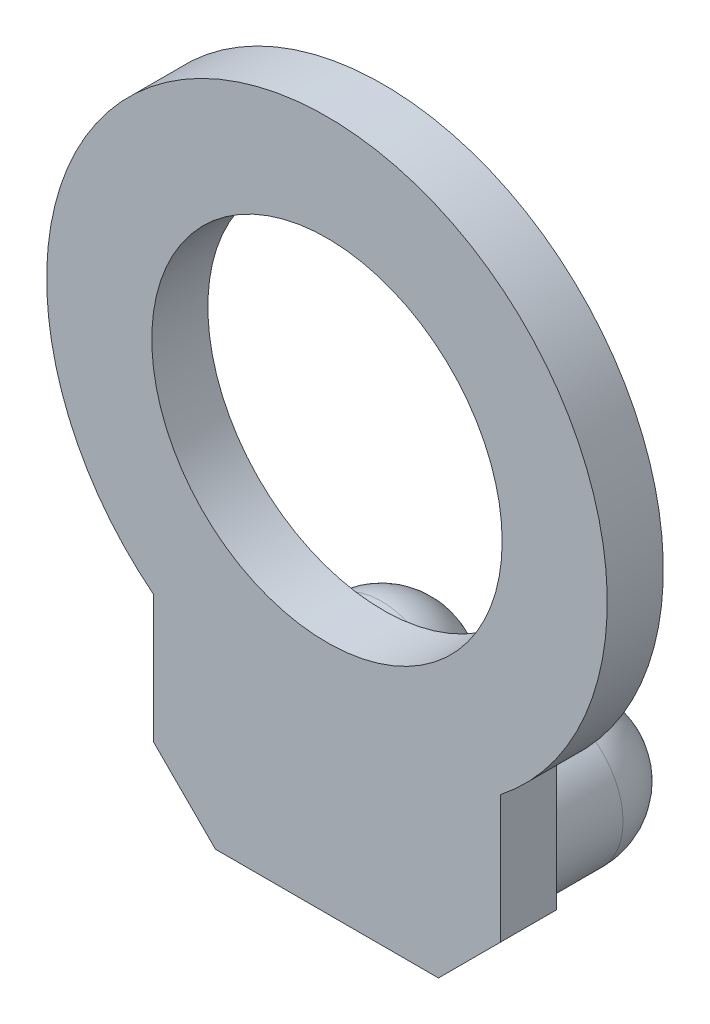
ISO-10303-21;
HEADER;
FILE_DESCRIPTION(('STEP AP214'),'2;1');
FILE_NAME('part.step','',(''),(''),'','','');
FILE_SCHEMA(('AUTOMOTIVE_DESIGN { 1 0 10303 214 1 1 1 1 }'));
ENDSEC;
DATA;
#1=APPLICATION_CONTEXT('core data for automotive mechanical design processes');
#2=APPLICATION_PROTOCOL_DEFINITION('international standard','automotive_design',2000,#1);
#3=PRODUCT_CONTEXT('',#1,'mechanical');
#4=PRODUCT('Part','Part','',(#3));
#5=PRODUCT_RELATED_PRODUCT_CATEGORY('part','',(#4));
#6=PRODUCT_DEFINITION_FORMATION('','',#4);
#7=PRODUCT_DEFINITION_CONTEXT('part definition',#1,'design');
#8=PRODUCT_DEFINITION('design','',#6,#7);
#9=PRODUCT_DEFINITION_SHAPE('','',#8);
#10=(LENGTH_UNIT() NAMED_UNIT(*) SI_UNIT(.MILLI.,.METRE.));
#11=(NAMED_UNIT(*) PLANE_ANGLE_UNIT() SI_UNIT($,.RADIAN.));
#12=(NAMED_UNIT(*) SI_UNIT($,.STERADIAN.) SOLID_ANGLE_UNIT());
#13=UNCERTAINTY_MEASURE_WITH_UNIT(LENGTH_MEASURE(1.E-05),#10,'distance_accuracy_value','');
#14=(GEOMETRIC_REPRESENTATION_CONTEXT(3) GLOBAL_UNCERTAINTY_ASSIGNED_CONTEXT((#13)) GLOBAL_UNIT_ASSIGNED_CONTEXT((#10,
#11,#12)) REPRESENTATION_CONTEXT('',''));
#15=CARTESIAN_POINT('',(0.,0.,0.));
#16=DIRECTION('',(0.,0.,1.));
#17=DIRECTION('',(1.,0.,0.));
#18=AXIS2_PLACEMENT_3D('',#15,#16,#17);
#19=CARTESIAN_POINT('',(4.95000000000013,0.,1.6));
#20=DIRECTION('',(-1.,0.,0.));
#21=DIRECTION('',(0.,-1.,0.));
#22=AXIS2_PLACEMENT_3D('',#19,#20,#21);
#23=PLANE('',#22);
#24=DIRECTION('',(0.,1.,0.));
#25=VECTOR('',#24,1.);
#26=CARTESIAN_POINT('',(4.95000000000013,0.,0.));
#27=LINE('',#26,#25);
#28=CARTESIAN_POINT('',(4.95000000000011,-9.93223304703357,0.));
#29=VERTEX_POINT('',#28);
#30=CARTESIAN_POINT('',(4.95000000000011,-6.28470365252005,0.));
#31=VERTEX_POINT('',#30);
#32=EDGE_CURVE('E132',#29,#31,#27,.T.);
#33=ORIENTED_EDGE('',*,*,#32,.T.);
#34=DIRECTION('',(0.,0.,-1.));
#35=VECTOR('',#34,1.);
#36=CARTESIAN_POINT('',(4.95000000000011,-6.28470365252005,1.6));
#37=LINE('',#36,#35);
#38=CARTESIAN_POINT('',(4.95000000000011,-6.28470365252005,1.6));
#39=VERTEX_POINT('',#38);
#40=EDGE_CURVE('E152',#39,#31,#37,.T.);
#41=ORIENTED_EDGE('',*,*,#40,.F.);
#42=DIRECTION('',(0.,1.,0.));
#43=VECTOR('',#42,1.);
#44=CARTESIAN_POINT('',(4.95000000000013,0.,1.6));
#45=LINE('',#44,#43);
#46=CARTESIAN_POINT('',(4.95000000000011,-9.93223304703357,1.6));
#47=VERTEX_POINT('',#46);
#48=EDGE_CURVE('E207',#47,#39,#45,.T.);
#49=ORIENTED_EDGE('',*,*,#48,.F.);
#50=DIRECTION('',(0.,0.,-1.));
#51=VECTOR('',#50,1.);
#52=CARTESIAN_POINT('',(4.95000000000011,-9.93223304703357,1.6));
#53=LINE('',#52,#51);
#54=EDGE_CURVE('E59',#47,#29,#53,.T.);
#55=ORIENTED_EDGE('',*,*,#54,.T.);
#56=EDGE_LOOP('',(#33,#41,#49,#55));
#57=FACE_BOUND('',#56,.T.);
#58=ADVANCED_FACE('F42',(#57),#23,.F.);
#59=CARTESIAN_POINT('',(1.2490009027033E-13,0.,1.6));
#60=DIRECTION('',(0.,0.,-1.));
#61=DIRECTION('',(-1.,0.,0.));
#62=AXIS2_PLACEMENT_3D('',#59,#60,#61);
#63=CYLINDRICAL_SURFACE('',#62,8.);
#64=CARTESIAN_POINT('',(1.2490009027033E-13,0.,0.));
#65=DIRECTION('',(0.,0.,1.));
#66=DIRECTION('',(1.,0.,0.));
#67=AXIS2_PLACEMENT_3D('',#64,#65,#66);
#68=CIRCLE('',#67,8.);
#69=CARTESIAN_POINT('',(-4.94999999999989,-6.28470365252004,0.));
#70=VERTEX_POINT('',#69);
#71=EDGE_CURVE('E135',#31,#70,#68,.T.);
#72=ORIENTED_EDGE('',*,*,#71,.T.);
#73=DIRECTION('',(0.,0.,-1.));
#74=VECTOR('',#73,1.);
#75=CARTESIAN_POINT('',(-4.94999999999989,-6.28470365252004,1.6));
#76=LINE('',#75,#74);
#77=CARTESIAN_POINT('',(-4.94999999999989,-6.28470365252004,1.6));
#78=VERTEX_POINT('',#77);
#79=EDGE_CURVE('E149',#78,#70,#76,.T.);
#80=ORIENTED_EDGE('',*,*,#79,.F.);
#81=CARTESIAN_POINT('',(1.2490009027033E-13,0.,1.6));
#82=DIRECTION('',(0.,0.,1.));
#83=DIRECTION('',(1.,0.,0.));
#84=AXIS2_PLACEMENT_3D('',#81,#82,#83);
#85=CIRCLE('',#84,8.);
#86=EDGE_CURVE('E93',#39,#78,#85,.T.);
#87=ORIENTED_EDGE('',*,*,#86,.F.);
#88=ORIENTED_EDGE('',*,*,#40,.T.);
#89=EDGE_LOOP('',(#72,#80,#87,#88));
#90=FACE_BOUND('',#89,.T.);
#91=ADVANCED_FACE('F171',(#90),#63,.T.);
#92=CARTESIAN_POINT('',(-4.94999999999988,0.,1.6));
#93=DIRECTION('',(1.,0.,0.));
#94=DIRECTION('',(0.,1.,0.));
#95=AXIS2_PLACEMENT_3D('',#92,#93,#94);
#96=PLANE('',#95);
#97=DIRECTION('',(0.,-1.,0.));
#98=VECTOR('',#97,1.);
#99=CARTESIAN_POINT('',(-4.94999999999988,0.,0.));
#100=LINE('',#99,#98);
#101=CARTESIAN_POINT('',(-4.94999999999989,-9.9322330470335,0.));
#102=VERTEX_POINT('',#101);
#103=EDGE_CURVE('E137',#70,#102,#100,.T.);
#104=ORIENTED_EDGE('',*,*,#103,.T.);
#105=DIRECTION('',(0.,0.,-1.));
#106=VECTOR('',#105,1.);
#107=CARTESIAN_POINT('',(-4.94999999999989,-9.9322330470335,1.6));
#108=LINE('',#107,#106);
#109=CARTESIAN_POINT('',(-4.94999999999989,-9.9322330470335,1.6));
#110=VERTEX_POINT('',#109);
#111=EDGE_CURVE('E121',#110,#102,#108,.T.);
#112=ORIENTED_EDGE('',*,*,#111,.F.);
#113=DIRECTION('',(0.,-1.,0.));
#114=VECTOR('',#113,1.);
#115=CARTESIAN_POINT('',(-4.94999999999988,0.,1.6));
#116=LINE('',#115,#114);
#117=EDGE_CURVE('E109',#78,#110,#116,.T.);
#118=ORIENTED_EDGE('',*,*,#117,.F.);
#119=ORIENTED_EDGE('',*,*,#79,.T.);
#120=EDGE_LOOP('',(#104,#112,#118,#119));
#121=FACE_BOUND('',#120,.T.);
#122=ADVANCED_FACE('F176',(#121),#96,.F.);
#123=CARTESIAN_POINT('',(-7.44111652351668,-7.44111652351672,1.6));
#124=DIRECTION('',(0.707106781186546,0.707106781186549,0.));
#125=DIRECTION('',(-0.707106781186549,0.707106781186546,0.));
#126=AXIS2_PLACEMENT_3D('',#123,#124,#125);
#127=PLANE('',#126);
#128=DIRECTION('',(0.707106781186549,-0.707106781186546,0.));
#129=VECTOR('',#128,1.);
#130=CARTESIAN_POINT('',(-7.44111652351668,-7.44111652351672,0.));
#131=LINE('',#130,#129);
#132=CARTESIAN_POINT('',(-3.18223304703352,-11.6999999999999,0.));
#133=VERTEX_POINT('',#132);
#134=EDGE_CURVE('E118',#102,#133,#131,.T.);
#135=ORIENTED_EDGE('',*,*,#134,.T.);
#136=DIRECTION('',(0.,0.,-1.));
#137=VECTOR('',#136,1.);
#138=CARTESIAN_POINT('',(-3.18223304703352,-11.6999999999999,1.6));
#139=LINE('',#138,#137);
#140=CARTESIAN_POINT('',(-3.18223304703352,-11.6999999999999,1.6));
#141=VERTEX_POINT('',#140);
#142=EDGE_CURVE('E115',#141,#133,#139,.T.);
#143=ORIENTED_EDGE('',*,*,#142,.F.);
#144=DIRECTION('',(0.707106781186549,-0.707106781186546,0.));
#145=VECTOR('',#144,1.);
#146=CARTESIAN_POINT('',(-7.44111652351668,-7.44111652351672,1.6));
#147=LINE('',#146,#145);
#148=EDGE_CURVE('E102',#110,#141,#147,.T.);
#149=ORIENTED_EDGE('',*,*,#148,.F.);
#150=ORIENTED_EDGE('',*,*,#111,.T.);
#151=EDGE_LOOP('',(#135,#143,#149,#150));
#152=FACE_BOUND('',#151,.T.);
#153=ADVANCED_FACE('F116',(#152),#127,.F.);
#154=CARTESIAN_POINT('',(-1.56260863688872E-13,-11.6999999999999,1.6));
#155=DIRECTION('',(0.,1.,0.));
#156=DIRECTION('',(-1.,0.,0.));
#157=AXIS2_PLACEMENT_3D('',#154,#155,#156);
#158=PLANE('',#157);
#159=DIRECTION('',(1.,0.,0.));
#160=VECTOR('',#159,1.);
#161=CARTESIAN_POINT('',(-1.56260863688872E-13,-11.6999999999999,0.));
#162=LINE('',#161,#160);
#163=CARTESIAN_POINT('',(3.18223304703374,-11.6999999999999,0.));
#164=VERTEX_POINT('',#163);
#165=EDGE_CURVE('E140',#133,#164,#162,.T.);
#166=ORIENTED_EDGE('',*,*,#165,.T.);
#167=DIRECTION('',(0.,0.,-1.));
#168=VECTOR('',#167,1.);
#169=CARTESIAN_POINT('',(3.18223304703374,-11.6999999999999,1.6));
#170=LINE('',#169,#168);
#171=CARTESIAN_POINT('',(3.18223304703374,-11.6999999999999,1.6));
#172=VERTEX_POINT('',#171);
#173=EDGE_CURVE('E80',#172,#164,#170,.T.);
#174=ORIENTED_EDGE('',*,*,#173,.F.);
#175=DIRECTION('',(1.,0.,0.));
#176=VECTOR('',#175,1.);
#177=CARTESIAN_POINT('',(-1.56260863688872E-13,-11.6999999999999,1.6));
#178=LINE('',#177,#176);
#179=EDGE_CURVE('E107',#141,#172,#178,.T.);
#180=ORIENTED_EDGE('',*,*,#179,.F.);
#181=ORIENTED_EDGE('',*,*,#142,.T.);
#182=EDGE_LOOP('',(#166,#174,#180,#181));
#183=FACE_BOUND('',#182,.T.);
#184=ADVANCED_FACE('F123',(#183),#158,.F.);
#185=CARTESIAN_POINT('',(1.2490009027033E-13,0.,1.6));
#186=DIRECTION('',(0.,0.,-1.));
#187=DIRECTION('',(-1.,0.,0.));
#188=AXIS2_PLACEMENT_3D('',#185,#186,#187);
#189=CYLINDRICAL_SURFACE('',#188,4.99999999999985);
#190=CARTESIAN_POINT('',(1.2490009027033E-13,0.,1.6));
#191=DIRECTION('',(0.,0.,1.));
#192=DIRECTION('',(1.,0.,0.));
#193=AXIS2_PLACEMENT_3D('',#190,#191,#192);
#194=CIRCLE('',#193,4.99999999999985);
#195=CARTESIAN_POINT('',(4.99999999999998,0.,1.6));
#196=VERTEX_POINT('',#195);
#197=EDGE_CURVE('E145',#196,#196,#194,.T.);
#198=ORIENTED_EDGE('',*,*,#197,.T.);
#199=EDGE_LOOP('',(#198));
#200=FACE_BOUND('',#199,.T.);
#201=CARTESIAN_POINT('',(1.2490009027033E-13,0.,0.));
#202=DIRECTION('',(0.,0.,1.));
#203=DIRECTION('',(1.,0.,0.));
#204=AXIS2_PLACEMENT_3D('',#201,#202,#203);
#205=CIRCLE('',#204,4.99999999999985);
#206=CARTESIAN_POINT('',(4.99999999999998,0.,0.));
#207=VERTEX_POINT('',#206);
#208=EDGE_CURVE('E129',#207,#207,#205,.T.);
#209=ORIENTED_EDGE('',*,*,#208,.F.);
#210=EDGE_LOOP('',(#209));
#211=FACE_BOUND('',#210,.T.);
#212=ADVANCED_FACE('F179',(#200,#211),#189,.F.);
#213=CARTESIAN_POINT('',(7.44111652351685,-7.44111652351681,1.6));
#214=DIRECTION('',(0.70710678118655,-0.707106781186545,0.));
#215=DIRECTION('',(0.707106781186545,0.70710678118655,0.));
#216=AXIS2_PLACEMENT_3D('',#213,#214,#215);
#217=PLANE('',#216);
#218=DIRECTION('',(-0.707106781186545,-0.70710678118655,0.));
#219=VECTOR('',#218,1.);
#220=CARTESIAN_POINT('',(7.44111652351685,-7.44111652351681,0.));
#221=LINE('',#220,#219);
#222=EDGE_CURVE('E142',#29,#164,#221,.T.);
#223=ORIENTED_EDGE('',*,*,#222,.F.);
#224=ORIENTED_EDGE('',*,*,#54,.F.);
#225=DIRECTION('',(-0.707106781186545,-0.70710678118655,0.));
#226=VECTOR('',#225,1.);
#227=CARTESIAN_POINT('',(7.44111652351685,-7.44111652351681,1.6));
#228=LINE('',#227,#226);
#229=EDGE_CURVE('E124',#47,#172,#228,.T.);
#230=ORIENTED_EDGE('',*,*,#229,.T.);
#231=ORIENTED_EDGE('',*,*,#173,.T.);
#232=EDGE_LOOP('',(#223,#224,#230,#231));
#233=FACE_BOUND('',#232,.T.);
#234=ADVANCED_FACE('F181',(#233),#217,.T.);
#235=CARTESIAN_POINT('',(0.,0.,1.6));
#236=DIRECTION('',(0.,0.,1.));
#237=DIRECTION('',(1.,0.,0.));
#238=AXIS2_PLACEMENT_3D('',#235,#236,#237);
#239=PLANE('',#238);
#240=ORIENTED_EDGE('',*,*,#197,.F.);
#241=EDGE_LOOP('',(#240));
#242=FACE_BOUND('',#241,.T.);
#243=ORIENTED_EDGE('',*,*,#48,.T.);
#244=ORIENTED_EDGE('',*,*,#86,.T.);
#245=ORIENTED_EDGE('',*,*,#117,.T.);
#246=ORIENTED_EDGE('',*,*,#148,.T.);
#247=ORIENTED_EDGE('',*,*,#179,.T.);
#248=ORIENTED_EDGE('',*,*,#229,.F.);
#249=EDGE_LOOP('',(#243,#244,#245,#246,#247,#248));
#250=FACE_BOUND('',#249,.T.);
#251=ADVANCED_FACE('F104',(#242,#250),#239,.T.);
#252=CARTESIAN_POINT('',(0.,0.,0.));
#253=DIRECTION('',(0.,0.,1.));
#254=DIRECTION('',(1.,0.,0.));
#255=AXIS2_PLACEMENT_3D('',#252,#253,#254);
#256=PLANE('',#255);
#257=ORIENTED_EDGE('',*,*,#208,.T.);
#258=EDGE_LOOP('',(#257));
#259=FACE_BOUND('',#258,.T.);
#260=CARTESIAN_POINT('',(2.45000000000011,-9.19999999999993,0.));
#261=DIRECTION('',(0.,0.,1.));
#262=DIRECTION('',(1.,0.,0.));
#263=AXIS2_PLACEMENT_3D('',#260,#261,#262);
#264=CIRCLE('',#263,1.99999999999997);
#265=CARTESIAN_POINT('',(4.45000000000008,-9.19999999999993,0.));
#266=VERTEX_POINT('',#265);
#267=EDGE_CURVE('E201',#266,#266,#264,.T.);
#268=ORIENTED_EDGE('',*,*,#267,.T.);
#269=EDGE_LOOP('',(#268));
#270=FACE_BOUND('',#269,.T.);
#271=CARTESIAN_POINT('',(-2.44999999999989,-9.19999999999987,0.));
#272=DIRECTION('',(0.,0.,1.));
#273=DIRECTION('',(1.,0.,0.));
#274=AXIS2_PLACEMENT_3D('',#271,#272,#273);
#275=CIRCLE('',#274,2.);
#276=CARTESIAN_POINT('',(-0.449999999999891,-9.19999999999987,0.));
#277=VERTEX_POINT('',#276);
#278=EDGE_CURVE('E133',#277,#277,#275,.T.);
#279=ORIENTED_EDGE('',*,*,#278,.T.);
#280=EDGE_LOOP('',(#279));
#281=FACE_BOUND('',#280,.T.);
#282=ORIENTED_EDGE('',*,*,#32,.F.);
#283=ORIENTED_EDGE('',*,*,#222,.T.);
#284=ORIENTED_EDGE('',*,*,#165,.F.);
#285=ORIENTED_EDGE('',*,*,#134,.F.);
#286=ORIENTED_EDGE('',*,*,#103,.F.);
#287=ORIENTED_EDGE('',*,*,#71,.F.);
#288=EDGE_LOOP('',(#282,#283,#284,#285,#286,#287));
#289=FACE_BOUND('',#288,.T.);
#290=ADVANCED_FACE('F194',(#259,#270,#281,#289),#256,.F.);
#291=CARTESIAN_POINT('',(-2.44999999999989,-9.19999999999987,-4.4));
#292=DIRECTION('',(0.,0.,1.));
#293=DIRECTION('',(1.,0.,0.));
#294=AXIS2_PLACEMENT_3D('',#291,#292,#293);
#295=CYLINDRICAL_SURFACE('',#294,2.);
#296=CARTESIAN_POINT('',(-2.44999999999989,-9.19999999999987,-2.4));
#297=DIRECTION('',(0.,0.,1.));
#298=DIRECTION('',(1.,0.,0.));
#299=AXIS2_PLACEMENT_3D('',#296,#297,#298);
#300=CIRCLE('',#299,2.);
#301=CARTESIAN_POINT('',(-0.449999999999891,-9.19999999999987,-2.4));
#302=VERTEX_POINT('',#301);
#303=EDGE_CURVE('E51',#302,#302,#300,.T.);
#304=ORIENTED_EDGE('',*,*,#303,.T.);
#305=EDGE_LOOP('',(#304));
#306=FACE_BOUND('',#305,.T.);
#307=ORIENTED_EDGE('',*,*,#278,.F.);
#308=EDGE_LOOP('',(#307));
#309=FACE_BOUND('',#308,.T.);
#310=ADVANCED_FACE('F156',(#306,#309),#295,.T.);
#311=CARTESIAN_POINT('',(2.45000000000011,-9.19999999999993,-4.4));
#312=DIRECTION('',(0.,0.,1.));
#313=DIRECTION('',(1.,0.,0.));
#314=AXIS2_PLACEMENT_3D('',#311,#312,#313);
#315=CYLINDRICAL_SURFACE('',#314,1.99999999999997);
#316=CARTESIAN_POINT('',(2.45000000000011,-9.19999999999993,-2.4));
#317=DIRECTION('',(0.,0.,1.));
#318=DIRECTION('',(1.,0.,0.));
#319=AXIS2_PLACEMENT_3D('',#316,#317,#318);
#320=CIRCLE('',#319,1.99999999999997);
#321=CARTESIAN_POINT('',(4.45000000000008,-9.19999999999993,-2.4));
#322=VERTEX_POINT('',#321);
#323=EDGE_CURVE('E11',#322,#322,#320,.T.);
#324=ORIENTED_EDGE('',*,*,#323,.T.);
#325=EDGE_LOOP('',(#324));
#326=FACE_BOUND('',#325,.T.);
#327=ORIENTED_EDGE('',*,*,#267,.F.);
#328=EDGE_LOOP('',(#327));
#329=FACE_BOUND('',#328,.T.);
#330=ADVANCED_FACE('F161',(#326,#329),#315,.T.);
#331=CARTESIAN_POINT('',(-2.44999999999989,-9.19999999999987,-2.4));
#332=DIRECTION('',(0.,0.,1.));
#333=DIRECTION('',(1.,0.,0.));
#334=AXIS2_PLACEMENT_3D('',#331,#332,#333);
#335=SPHERICAL_SURFACE('',#334,2.);
#336=ORIENTED_EDGE('',*,*,#303,.F.);
#337=EDGE_LOOP('',(#336));
#338=FACE_BOUND('',#337,.T.);
#339=ADVANCED_FACE('F159',(#338),#335,.T.);
#340=CARTESIAN_POINT('',(2.45000000000011,-9.19999999999993,-2.4));
#341=DIRECTION('',(0.,0.,1.));
#342=DIRECTION('',(1.,0.,0.));
#343=AXIS2_PLACEMENT_3D('',#340,#341,#342);
#344=SPHERICAL_SURFACE('',#343,2.);
#345=ORIENTED_EDGE('',*,*,#323,.F.);
#346=EDGE_LOOP('',(#345));
#347=FACE_BOUND('',#346,.T.);
#348=ADVANCED_FACE('F44',(#347),#344,.T.);
#349=CLOSED_SHELL('',(#58,#91,#122,#153,#184,#212,#234,#251,#290,#310,#330,#339,#348));
#350=MANIFOLD_SOLID_BREP('B2',#349);
#351=ADVANCED_BREP_SHAPE_REPRESENTATION('',(#18,#350),#14);
#352=SHAPE_DEFINITION_REPRESENTATION(#9,#351);
ENDSEC;
END-ISO-10303-21;
